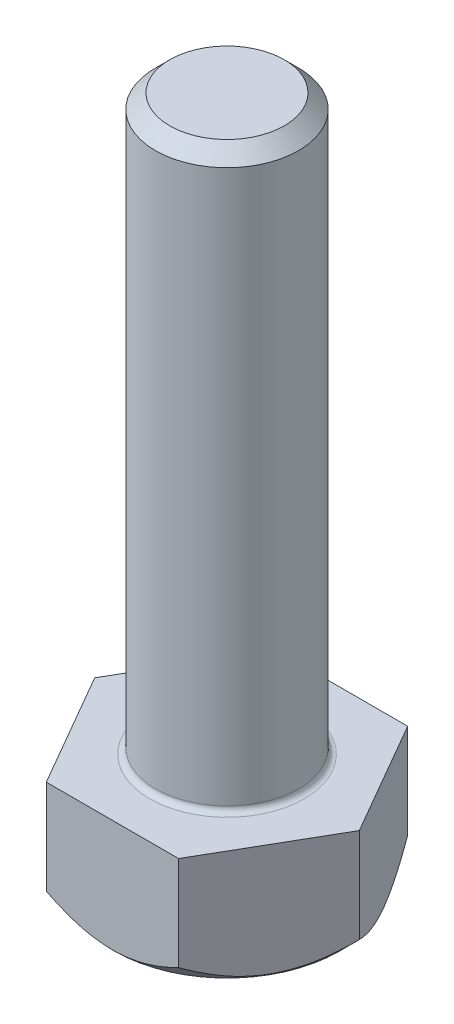
ISO-10303-21;
HEADER;
FILE_DESCRIPTION(('STEP AP214'),'2;1');
FILE_NAME('part.step','',(''),(''),'','','');
FILE_SCHEMA(('AUTOMOTIVE_DESIGN { 1 0 10303 214 1 1 1 1 }'));
ENDSEC;
DATA;
#1=APPLICATION_CONTEXT('core data for automotive mechanical design processes');
#2=APPLICATION_PROTOCOL_DEFINITION('international standard','automotive_design',2000,#1);
#3=PRODUCT_CONTEXT('',#1,'mechanical');
#4=PRODUCT('Part','Part','',(#3));
#5=PRODUCT_RELATED_PRODUCT_CATEGORY('part','',(#4));
#6=PRODUCT_DEFINITION_FORMATION('','',#4);
#7=PRODUCT_DEFINITION_CONTEXT('part definition',#1,'design');
#8=PRODUCT_DEFINITION('design','',#6,#7);
#9=PRODUCT_DEFINITION_SHAPE('','',#8);
#10=(LENGTH_UNIT() NAMED_UNIT(*) SI_UNIT(.MILLI.,.METRE.));
#11=(NAMED_UNIT(*) PLANE_ANGLE_UNIT() SI_UNIT($,.RADIAN.));
#12=(NAMED_UNIT(*) SI_UNIT($,.STERADIAN.) SOLID_ANGLE_UNIT());
#13=UNCERTAINTY_MEASURE_WITH_UNIT(LENGTH_MEASURE(1.E-05),#10,'distance_accuracy_value','');
#14=(GEOMETRIC_REPRESENTATION_CONTEXT(3) GLOBAL_UNCERTAINTY_ASSIGNED_CONTEXT((#13)) GLOBAL_UNIT_ASSIGNED_CONTEXT((#10,
#11,#12)) REPRESENTATION_CONTEXT('',''));
#15=CARTESIAN_POINT('',(0.,0.,0.));
#16=DIRECTION('',(0.,0.,1.));
#17=DIRECTION('',(1.,0.,0.));
#18=AXIS2_PLACEMENT_3D('',#15,#16,#17);
#19=CARTESIAN_POINT('',(2.30940107675855,4.,3.99999999999998));
#20=DIRECTION('',(-0.866025403784441,0.,-0.499999999999995));
#21=DIRECTION('',(-0.499999999999995,0.,0.866025403784442));
#22=AXIS2_PLACEMENT_3D('',#19,#20,#21);
#23=PLANE('',#22);
#24=CARTESIAN_POINT('',(4.61891762357085,0.700115474383801,-0.0002));
#25=CARTESIAN_POINT('',(4.57920690352856,0.660408855957502,0.0685809847183902));
#26=CARTESIAN_POINT('',(4.53919230356691,0.621920417113094,0.137888304896515));
#27=CARTESIAN_POINT('',(4.45849274714726,0.547751223735454,0.27766403676362));
#28=CARTESIAN_POINT('',(4.41780743901012,0.512072002731591,0.348133057578738));
#29=CARTESIAN_POINT('',(4.29427352009146,0.409500867650948,0.562100081603956));
#30=CARTESIAN_POINT('',(4.21037499527404,0.347513111012522,0.707416589267811));
#31=CARTESIAN_POINT('',(4.0412197030244,0.241355869009374,1.00040214981335));
#32=CARTESIAN_POINT('',(3.95600566300928,0.196919055453413,1.14799719663775));
#33=CARTESIAN_POINT('',(3.78369592639702,0.128448982129438,1.44644641508899));
#34=CARTESIAN_POINT('',(3.69660550696163,0.104364637861304,1.59729144640358));
#35=CARTESIAN_POINT('',(3.54650860589263,0.0826348808605432,1.85726690511373));
#36=CARTESIAN_POINT('',(3.48369550790696,0.079418914640874,1.96606238220571));
#37=CARTESIAN_POINT('',(3.35817126167368,0.0848400582250343,2.18347675426355));
#38=CARTESIAN_POINT('',(3.29546015687907,0.0934813231718715,2.29209557396659));
#39=CARTESIAN_POINT('',(3.17063214810068,0.122124038496493,2.50830402737842));
#40=CARTESIAN_POINT('',(3.10851598784022,0.142138194551335,2.61589237292061));
#41=CARTESIAN_POINT('',(2.98535047827849,0.192434157364746,2.82922129322166));
#42=CARTESIAN_POINT('',(2.92430104755958,0.222715176878471,2.93496200899997));
#43=CARTESIAN_POINT('',(2.81592361944269,0.285015252694335,3.12267722089207));
#44=CARTESIAN_POINT('',(2.76835567444969,0.315396279860205,3.20506731843159));
#45=CARTESIAN_POINT('',(2.67407371522753,0.381054464560417,3.36836846204151));
#46=CARTESIAN_POINT('',(2.62735972702472,0.416331771039843,3.44927946303294));
#47=CARTESIAN_POINT('',(2.53493285809123,0.490991687020957,3.60936749601025));
#48=CARTESIAN_POINT('',(2.48921734857497,0.530361387003614,3.68854908118633));
#49=CARTESIAN_POINT('',(2.39863292742737,0.612689108143273,3.84544590098819));
#50=CARTESIAN_POINT('',(2.35376351682292,0.655644927801908,3.92316199986077));
#51=CARTESIAN_POINT('',(2.30928560670471,0.700115474383791,4.00019999999998));
#52=B_SPLINE_CURVE_WITH_KNOTS('',3,(#24,#25,#26,#27,#28,#29,#30,#31,#32,#33,#34,#35,#36,#37,#38,
#39,#40,#41,#42,#43,#44,#45,#46,#47,#48,#49,#50,#51),.UNSPECIFIED.,.F.,.F.,(4,2,2,2,2,2,2,2,2,2,
2,2,2,4),(0.,0.266361961703682,0.532868334400148,1.06875865685469,1.59613884594061,
2.12219135055594,2.49866160599677,2.87526382203519,3.25228760372107,3.62928248242894,
3.92874944437186,4.22822551811358,4.52678401907575,4.82516056577912),.UNSPECIFIED.);
#53=CARTESIAN_POINT('',(4.618802153517,0.699999999999939,0.));
#54=VERTEX_POINT('',#53);
#55=CARTESIAN_POINT('',(2.30940107675855,0.699999999999935,3.99999999999998));
#56=VERTEX_POINT('',#55);
#57=EDGE_CURVE('E51',#54,#56,#52,.T.);
#58=ORIENTED_EDGE('',*,*,#57,.F.);
#59=DIRECTION('',(0.,-1.,0.));
#60=VECTOR('',#59,1.);
#61=CARTESIAN_POINT('',(4.61880215351701,4.,0.));
#62=LINE('',#61,#60);
#63=CARTESIAN_POINT('',(4.61880215351701,4.,0.));
#64=VERTEX_POINT('',#63);
#65=EDGE_CURVE('E101',#64,#54,#62,.T.);
#66=ORIENTED_EDGE('',*,*,#65,.F.);
#67=DIRECTION('',(0.499999999999995,0.,-0.866025403784441));
#68=VECTOR('',#67,1.);
#69=CARTESIAN_POINT('',(2.30940107675855,4.,3.99999999999998));
#70=LINE('',#69,#68);
#71=CARTESIAN_POINT('',(2.30940107675855,4.,3.99999999999998));
#72=VERTEX_POINT('',#71);
#73=EDGE_CURVE('E103',#72,#64,#70,.T.);
#74=ORIENTED_EDGE('',*,*,#73,.F.);
#75=DIRECTION('',(0.,-1.,0.));
#76=VECTOR('',#75,1.);
#77=CARTESIAN_POINT('',(2.30940107675855,4.,3.99999999999998));
#78=LINE('',#77,#76);
#79=EDGE_CURVE('E102',#72,#56,#78,.T.);
#80=ORIENTED_EDGE('',*,*,#79,.T.);
#81=EDGE_LOOP('',(#58,#66,#74,#80));
#82=FACE_BOUND('',#81,.T.);
#83=ADVANCED_FACE('F35',(#82),#23,.F.);
#84=CARTESIAN_POINT('',(4.61880215351701,4.,0.));
#85=DIRECTION('',(-0.866025403784438,0.,0.500000000000001));
#86=DIRECTION('',(0.500000000000001,0.,0.866025403784438));
#87=AXIS2_PLACEMENT_3D('',#84,#85,#86);
#88=PLANE('',#87);
#89=CARTESIAN_POINT('',(2.30928560670466,0.700115474383792,-4.00020000000001));
#90=CARTESIAN_POINT('',(2.34899632674695,0.660408855957493,-3.93141901528162));
#91=CARTESIAN_POINT('',(2.3890109267086,0.621920417113085,-3.86211169510349));
#92=CARTESIAN_POINT('',(2.46971048312825,0.547751223735444,-3.72233596323639));
#93=CARTESIAN_POINT('',(2.51039579126539,0.51207200273158,-3.65186694242127));
#94=CARTESIAN_POINT('',(2.63392971018405,0.409500867650934,-3.43789991839605));
#95=CARTESIAN_POINT('',(2.71782823500148,0.347513111012507,-3.29258341073219));
#96=CARTESIAN_POINT('',(2.88698352725112,0.241355869009358,-2.99959785018666));
#97=CARTESIAN_POINT('',(2.97219756726624,0.196919055453397,-2.85200280336225));
#98=CARTESIAN_POINT('',(3.1445073038785,0.128448982129421,-2.553553584911));
#99=CARTESIAN_POINT('',(3.2315977233139,0.104364637861287,-2.40270855359642));
#100=CARTESIAN_POINT('',(3.3816946243829,0.0826348808605273,-2.14273309488627));
#101=CARTESIAN_POINT('',(3.44450772236857,0.0794189146408588,-2.03393761779429));
#102=CARTESIAN_POINT('',(3.57003196860185,0.0848400582250196,-1.81652324573645));
#103=CARTESIAN_POINT('',(3.63274307339646,0.0934813231718567,-1.70790442603341));
#104=CARTESIAN_POINT('',(3.75757108217486,0.122124038496478,-1.49169597262158));
#105=CARTESIAN_POINT('',(3.81968724243531,0.14213819455132,-1.38410762707939));
#106=CARTESIAN_POINT('',(3.94285275199705,0.192434157364731,-1.17077870677835));
#107=CARTESIAN_POINT('',(4.00390218271596,0.222715176878456,-1.06503799100004));
#108=CARTESIAN_POINT('',(4.11227961083285,0.285015252694322,-0.877322779107935));
#109=CARTESIAN_POINT('',(4.15984755582585,0.315396279860193,-0.794932681568415));
#110=CARTESIAN_POINT('',(4.25412951504802,0.381054464560409,-0.631631537958489));
#111=CARTESIAN_POINT('',(4.30084350325083,0.416331771039837,-0.55072053696705));
#112=CARTESIAN_POINT('',(4.39327037218432,0.490991687020955,-0.390632503989735));
#113=CARTESIAN_POINT('',(4.43898588170059,0.530361387003614,-0.311450918813657));
#114=CARTESIAN_POINT('',(4.52957030284819,0.612689108143277,-0.154554099011793));
#115=CARTESIAN_POINT('',(4.57443971345265,0.655644927801915,-0.0768380001392093));
#116=CARTESIAN_POINT('',(4.61891762357085,0.700115474383801,0.000200000000000161));
#117=B_SPLINE_CURVE_WITH_KNOTS('',3,(#89,#90,#91,#92,#93,#94,#95,#96,#97,#98,#99,#100,#101,#102,
#103,#104,#105,#106,#107,#108,#109,#110,#111,#112,#113,#114,#115,#116),.UNSPECIFIED.,.F.,.F.,(4,
2,2,2,2,2,2,2,2,2,2,2,2,4),(0.,0.266361961703685,0.532868334400154,1.0687586568547,
1.59613884594063,2.12219135055597,2.4986616059968,2.87526382203522,3.25228760372109,
3.62928248242896,3.92874944437189,4.22822551811363,4.52678401907581,4.82516056577918),.UNSPECIFIED.);
#118=CARTESIAN_POINT('',(2.30940107675849,0.699999999999931,-4.00000000000001));
#119=VERTEX_POINT('',#118);
#120=EDGE_CURVE('E88',#119,#54,#117,.T.);
#121=ORIENTED_EDGE('',*,*,#120,.F.);
#122=DIRECTION('',(0.,-1.,0.));
#123=VECTOR('',#122,1.);
#124=CARTESIAN_POINT('',(2.3094010767585,4.,-4.00000000000001));
#125=LINE('',#124,#123);
#126=CARTESIAN_POINT('',(2.3094010767585,4.,-4.00000000000001));
#127=VERTEX_POINT('',#126);
#128=EDGE_CURVE('E108',#127,#119,#125,.T.);
#129=ORIENTED_EDGE('',*,*,#128,.F.);
#130=DIRECTION('',(-0.500000000000001,0.,-0.866025403784438));
#131=VECTOR('',#130,1.);
#132=CARTESIAN_POINT('',(4.61880215351701,4.,0.));
#133=LINE('',#132,#131);
#134=EDGE_CURVE('E106',#64,#127,#133,.T.);
#135=ORIENTED_EDGE('',*,*,#134,.F.);
#136=ORIENTED_EDGE('',*,*,#65,.T.);
#137=EDGE_LOOP('',(#121,#129,#135,#136));
#138=FACE_BOUND('',#137,.T.);
#139=ADVANCED_FACE('F105',(#138),#88,.F.);
#140=CARTESIAN_POINT('',(2.3094010767585,4.,-4.00000000000001));
#141=DIRECTION('',(0.,0.,1.));
#142=DIRECTION('',(1.,0.,0.));
#143=AXIS2_PLACEMENT_3D('',#140,#141,#142);
#144=PLANE('',#143);
#145=CARTESIAN_POINT('',(-6.98114614593353,4.12709130282916,-3.99999999999998));
#146=CARTESIAN_POINT('',(-6.87793696104197,4.0375426009286,-3.99999999999998));
#147=CARTESIAN_POINT('',(-6.77448735267709,3.94827096608037,-3.99999999999998));
#148=CARTESIAN_POINT('',(-6.56704338795069,3.77035957027395,-3.99999999999998));
#149=CARTESIAN_POINT('',(-6.46304902264425,3.6817198197481,-3.99999999999998));
#150=CARTESIAN_POINT('',(-6.15006176117822,3.41678791917285,-3.99999999999998));
#151=CARTESIAN_POINT('',(-5.94015986764224,3.24156593852898,-3.99999999999998));
#152=CARTESIAN_POINT('',(-5.51245052817203,2.89087900779337,-3.99999999999998));
#153=CARTESIAN_POINT('',(-5.29457210444063,2.71550031208714,-3.99999999999998));
#154=CARTESIAN_POINT('',(-4.85471772987806,2.37005614421194,-3.99999999999998));
#155=CARTESIAN_POINT('',(-4.63274281899686,2.19998935227496,-3.99999999999998));
#156=CARTESIAN_POINT('',(-4.18302639527992,1.86693432484984,-3.99999999999999));
#157=CARTESIAN_POINT('',(-3.95527761496562,1.70395579092458,-3.99999999999999));
#158=CARTESIAN_POINT('',(-3.60809717220038,1.46740672114988,-3.99999999999999));
#159=CARTESIAN_POINT('',(-3.49138801077282,1.38984224523112,-3.99999999999999));
#160=CARTESIAN_POINT('',(-3.25585955363092,1.23798940126102,-3.99999999999999));
#161=CARTESIAN_POINT('',(-3.13704040222774,1.16370081035927,-3.99999999999999));
#162=CARTESIAN_POINT('',(-2.89788149990968,1.01968693934192,-3.99999999999999));
#163=CARTESIAN_POINT('',(-2.77756007053809,0.949931370318152,-3.99999999999999));
#164=CARTESIAN_POINT('',(-2.53417882035755,0.815306091805872,-3.99999999999999));
#165=CARTESIAN_POINT('',(-2.41111867188936,0.750436971045192,-3.99999999999999));
#166=CARTESIAN_POINT('',(-2.16214673136424,0.626879037223734,-3.99999999999999));
#167=CARTESIAN_POINT('',(-2.03623963272419,0.568180841756657,-3.99999999999999));
#168=CARTESIAN_POINT('',(-1.78118073645083,0.458339075920007,-4.));
#169=CARTESIAN_POINT('',(-1.65202983110933,0.407193454084758,-4.));
#170=CARTESIAN_POINT('',(-1.38738138766726,0.313123320819659,-4.));
#171=CARTESIAN_POINT('',(-1.25180623112649,0.270414105323999,-4.));
#172=CARTESIAN_POINT('',(-0.977462181490911,0.196777650494333,-4.));
#173=CARTESIAN_POINT('',(-0.838693801721602,0.165848531293118,-4.));
#174=CARTESIAN_POINT('',(-0.559624752362383,0.117833620010087,-4.));
#175=CARTESIAN_POINT('',(-0.419338998099909,0.100662853961317,-4.));
#176=CARTESIAN_POINT('',(-0.137732511117991,0.0811049255479451,-4.));
#177=CARTESIAN_POINT('',(0.00358810879581085,0.078716175195079,-4.));
#178=CARTESIAN_POINT('',(0.285874972510526,0.0889146058383092,-4.));
#179=CARTESIAN_POINT('',(0.426840437320116,0.101522875026919,-4.));
#180=CARTESIAN_POINT('',(0.706785540830818,0.140792857614438,-4.));
#181=CARTESIAN_POINT('',(0.845764780734548,0.1674573536336,-4.00000000000001));
#182=CARTESIAN_POINT('',(1.12171525898713,0.233322674772973,-4.00000000000001));
#183=CARTESIAN_POINT('',(1.25866510523636,0.272611558158177,-4.00000000000001));
#184=CARTESIAN_POINT('',(1.52908834069935,0.361594405827923,-4.00000000000001));
#185=CARTESIAN_POINT('',(1.6625616855479,0.411288502825075,-4.00000000000001));
#186=CARTESIAN_POINT('',(1.95536122449262,0.531120895026026,-4.00000000000001));
#187=CARTESIAN_POINT('',(2.11382544400314,0.603347532343984,-4.00000000000001));
#188=CARTESIAN_POINT('',(2.42603794900499,0.757437129001317,-4.00000000000001));
#189=CARTESIAN_POINT('',(2.57978344985653,0.839305645488604,-4.00000000000001));
#190=CARTESIAN_POINT('',(2.88342663972389,1.01053885711325,-4.00000000000001));
#191=CARTESIAN_POINT('',(3.03331571463857,1.099918703133,-4.00000000000001));
#192=CARTESIAN_POINT('',(3.32952662511669,1.28430474396474,-4.00000000000001));
#193=CARTESIAN_POINT('',(3.47584916027498,1.37930982261507,-4.00000000000001));
#194=CARTESIAN_POINT('',(3.76630620503074,1.57423103979624,-4.00000000000001));
#195=CARTESIAN_POINT('',(3.91042486029584,1.67417069197554,-4.00000000000002));
#196=CARTESIAN_POINT('',(4.19616634067178,1.87755425690437,-4.00000000000002));
#197=CARTESIAN_POINT('',(4.33778907534001,1.98099829624419,-4.00000000000002));
#198=CARTESIAN_POINT('',(4.61877643054636,2.19056329764121,-4.00000000000002));
#199=CARTESIAN_POINT('',(4.75814350045658,2.29668098420657,-4.00000000000002));
#200=CARTESIAN_POINT('',(5.03512024738794,2.51118879382164,-4.00000000000002));
#201=CARTESIAN_POINT('',(5.17272986712145,2.6195789906457,-4.00000000000002));
#202=CARTESIAN_POINT('',(5.59497795008181,2.95681598614826,-4.00000000000002));
#203=CARTESIAN_POINT('',(5.8771451391583,3.18875848422638,-4.00000000000002));
#204=CARTESIAN_POINT('',(6.29540023140548,3.53951322082581,-4.00000000000002));
#205=CARTESIAN_POINT('',(6.43324157418379,3.65625547859004,-4.00000000000002));
#206=CARTESIAN_POINT('',(6.7079094900278,3.8908680732726,-4.00000000000003));
#207=CARTESIAN_POINT('',(6.84473627717866,4.00873815944256,-4.00000000000003));
#208=CARTESIAN_POINT('',(6.98114614593351,4.12709130282924,-4.00000000000003));
#209=B_SPLINE_CURVE_WITH_KNOTS('',3,(#145,#146,#147,#148,#149,#150,#151,#152,#153,#154,#155,
#156,#157,#158,#159,#160,#161,#162,#163,#164,#165,#166,#167,#168,#169,#170,#171,#172,#173,#174,
#175,#176,#177,#178,#179,#180,#181,#182,#183,#184,#185,#186,#187,#188,#189,#190,#191,#192,#193,
#194,#195,#196,#197,#198,#199,#200,#201,#202,#203,#204,#205,#206,#207,#208),.UNSPECIFIED.,.F.,
.F.,(4,2,2,2,2,2,2,2,2,2,2,2,2,2,2,2,2,2,2,2,2,2,2,2,2,2,2,2,2,2,2,4),(0.,0.409925978651295,
0.819858709524671,1.64010261713085,2.47912275465721,3.31793274805462,4.15785682736262,
4.57821400157808,4.99854253567476,5.41568896936065,5.83288558145875,6.24943841487735,
6.66587789330006,7.09186216213645,7.51777842391307,7.94104342726952,8.36426295972796,
8.78807831030743,9.21197759239367,9.63890031479421,10.0658284826842,10.5878304384244,
11.1101347388045,11.6335190846318,12.1567999260297,12.6828747803224,13.2089686585187,
13.7344466666551,14.2599417603085,15.3555993243773,15.8975012917649,16.439285455911),.UNSPECIFIED.);
#210=CARTESIAN_POINT('',(-2.30940107675852,0.699999999999915,-3.99999999999999));
#211=VERTEX_POINT('',#210);
#212=EDGE_CURVE('E91',#211,#119,#209,.T.);
#213=ORIENTED_EDGE('',*,*,#212,.F.);
#214=DIRECTION('',(0.,-1.,0.));
#215=VECTOR('',#214,1.);
#216=CARTESIAN_POINT('',(-2.30940107675852,4.,-3.99999999999999));
#217=LINE('',#216,#215);
#218=CARTESIAN_POINT('',(-2.30940107675852,4.,-3.99999999999999));
#219=VERTEX_POINT('',#218);
#220=EDGE_CURVE('E113',#219,#211,#217,.T.);
#221=ORIENTED_EDGE('',*,*,#220,.F.);
#222=DIRECTION('',(-1.,0.,0.));
#223=VECTOR('',#222,1.);
#224=CARTESIAN_POINT('',(2.3094010767585,4.,-4.00000000000001));
#225=LINE('',#224,#223);
#226=EDGE_CURVE('E294',#127,#219,#225,.T.);
#227=ORIENTED_EDGE('',*,*,#226,.F.);
#228=ORIENTED_EDGE('',*,*,#128,.T.);
#229=EDGE_LOOP('',(#213,#221,#227,#228));
#230=FACE_BOUND('',#229,.T.);
#231=ADVANCED_FACE('F137',(#230),#144,.F.);
#232=CARTESIAN_POINT('',(-2.30940107675852,4.,-3.99999999999999));
#233=DIRECTION('',(0.866025403784442,0.,0.499999999999995));
#234=DIRECTION('',(0.499999999999995,0.,-0.866025403784442));
#235=AXIS2_PLACEMENT_3D('',#232,#233,#234);
#236=PLANE('',#235);
#237=CARTESIAN_POINT('',(-4.61891762357085,0.700115474383764,0.000200000000032253));
#238=CARTESIAN_POINT('',(-4.57920690352856,0.660408855957465,-0.0685809847183586));
#239=CARTESIAN_POINT('',(-4.53919230356691,0.621920417113057,-0.137888304896484));
#240=CARTESIAN_POINT('',(-4.45849274714725,0.547751223735416,-0.277664036763591));
#241=CARTESIAN_POINT('',(-4.41780743901012,0.512072002731552,-0.34813305757871));
#242=CARTESIAN_POINT('',(-4.29427352009146,0.409500867650907,-0.56210008160393));
#243=CARTESIAN_POINT('',(-4.21037499527403,0.347513111012481,-0.707416589267787));
#244=CARTESIAN_POINT('',(-4.04121970302439,0.241355869009332,-1.00040214981333));
#245=CARTESIAN_POINT('',(-3.95600566300927,0.196919055453371,-1.14799719663773));
#246=CARTESIAN_POINT('',(-3.78369592639701,0.128448982129395,-1.44644641508898));
#247=CARTESIAN_POINT('',(-3.69660550696162,0.104364637861261,-1.59729144640356));
#248=CARTESIAN_POINT('',(-3.54650860589262,0.0826348808605014,-1.85726690511372));
#249=CARTESIAN_POINT('',(-3.48369550790695,0.0794189146408329,-1.9660623822057));
#250=CARTESIAN_POINT('',(-3.35817126167366,0.0848400582249946,-2.18347675426354));
#251=CARTESIAN_POINT('',(-3.29546015687905,0.0934813231718324,-2.29209557396658));
#252=CARTESIAN_POINT('',(-3.17063214810066,0.122124038496455,-2.50830402737842));
#253=CARTESIAN_POINT('',(-3.10851598784021,0.142138194551297,-2.61589237292061));
#254=CARTESIAN_POINT('',(-2.98535047827847,0.192434157364709,-2.82922129322165));
#255=CARTESIAN_POINT('',(-2.92430104755956,0.222715176878433,-2.93496200899996));
#256=CARTESIAN_POINT('',(-2.81592361944267,0.285015252694299,-3.12267722089207));
#257=CARTESIAN_POINT('',(-2.76835567444967,0.315396279860171,-3.20506731843159));
#258=CARTESIAN_POINT('',(-2.67407371522751,0.381054464560386,-3.36836846204151));
#259=CARTESIAN_POINT('',(-2.6273597270247,0.416331771039814,-3.44927946303295));
#260=CARTESIAN_POINT('',(-2.53493285809121,0.49099168702093,-3.60936749601026));
#261=CARTESIAN_POINT('',(-2.48921734857494,0.530361387003589,-3.68854908118634));
#262=CARTESIAN_POINT('',(-2.39863292742734,0.612689108143251,-3.8454459009882));
#263=CARTESIAN_POINT('',(-2.35376351682289,0.655644927801888,-3.92316199986078));
#264=CARTESIAN_POINT('',(-2.30928560670469,0.700115474383773,-4.00019999999999));
#265=B_SPLINE_CURVE_WITH_KNOTS('',3,(#237,#238,#239,#240,#241,#242,#243,#244,#245,#246,#247,
#248,#249,#250,#251,#252,#253,#254,#255,#256,#257,#258,#259,#260,#261,#262,#263,#264),
.UNSPECIFIED.,.F.,.F.,(4,2,2,2,2,2,2,2,2,2,2,2,2,4),(0.,0.266361961703685,0.532868334400154,
1.06875865685471,1.59613884594063,2.12219135055597,2.4986616059968,2.87526382203523,
3.25228760372111,3.62928248242897,3.9287494443719,4.22822551811363,4.52678401907581,
4.82516056577918),.UNSPECIFIED.);
#266=CARTESIAN_POINT('',(-4.61880215351701,0.699999999999907,0.));
#267=VERTEX_POINT('',#266);
#268=EDGE_CURVE('E180',#267,#211,#265,.T.);
#269=ORIENTED_EDGE('',*,*,#268,.F.);
#270=DIRECTION('',(0.,-1.,0.));
#271=VECTOR('',#270,1.);
#272=CARTESIAN_POINT('',(-4.61880215351701,4.,0.));
#273=LINE('',#272,#271);
#274=CARTESIAN_POINT('',(-4.61880215351701,4.,0.));
#275=VERTEX_POINT('',#274);
#276=EDGE_CURVE('E306',#275,#267,#273,.T.);
#277=ORIENTED_EDGE('',*,*,#276,.F.);
#278=DIRECTION('',(-0.499999999999995,0.,0.866025403784442));
#279=VECTOR('',#278,1.);
#280=CARTESIAN_POINT('',(-2.30940107675852,4.,-3.99999999999999));
#281=LINE('',#280,#279);
#282=EDGE_CURVE('E295',#219,#275,#281,.T.);
#283=ORIENTED_EDGE('',*,*,#282,.F.);
#284=ORIENTED_EDGE('',*,*,#220,.T.);
#285=EDGE_LOOP('',(#269,#277,#283,#284));
#286=FACE_BOUND('',#285,.T.);
#287=ADVANCED_FACE('F192',(#286),#236,.F.);
#288=CARTESIAN_POINT('',(-4.61880215351701,4.,0.));
#289=DIRECTION('',(0.866025403784435,0.,-0.500000000000007));
#290=DIRECTION('',(-0.500000000000007,0.,-0.866025403784434));
#291=AXIS2_PLACEMENT_3D('',#288,#289,#290);
#292=PLANE('',#291);
#293=CARTESIAN_POINT('',(-2.30928560670463,0.700115474383773,4.00020000000003));
#294=CARTESIAN_POINT('',(-2.34899632674692,0.660408855957473,3.93141901528163));
#295=CARTESIAN_POINT('',(-2.38901092670857,0.621920417113066,3.86211169510351));
#296=CARTESIAN_POINT('',(-2.46971048312823,0.547751223735424,3.7223359632364));
#297=CARTESIAN_POINT('',(-2.51039579126536,0.51207200273156,3.65186694242129));
#298=CARTESIAN_POINT('',(-2.63392971018403,0.409500867650914,3.43789991839607));
#299=CARTESIAN_POINT('',(-2.71782823500145,0.347513111012486,3.29258341073221));
#300=CARTESIAN_POINT('',(-2.8869835272511,0.241355869009336,2.99959785018667));
#301=CARTESIAN_POINT('',(-2.97219756726622,0.196919055453374,2.85200280336227));
#302=CARTESIAN_POINT('',(-3.14450730387849,0.128448982129398,2.55355358491102));
#303=CARTESIAN_POINT('',(-3.23159772331388,0.104364637861263,2.40270855359644));
#304=CARTESIAN_POINT('',(-3.38169462438288,0.082634880860502,2.14273309488629));
#305=CARTESIAN_POINT('',(-3.44450772236856,0.0794189146408329,2.03393761779431));
#306=CARTESIAN_POINT('',(-3.57003196860184,0.0848400582249938,1.81652324573647));
#307=CARTESIAN_POINT('',(-3.63274307339646,0.0934813231718314,1.70790442603343));
#308=CARTESIAN_POINT('',(-3.75757108217485,0.122124038496453,1.4916959726216));
#309=CARTESIAN_POINT('',(-3.8196872424353,0.142138194551294,1.38410762707941));
#310=CARTESIAN_POINT('',(-3.94285275199704,0.192434157364705,1.17077870677836));
#311=CARTESIAN_POINT('',(-4.00390218271596,0.222715176878429,1.06503799100005));
#312=CARTESIAN_POINT('',(-4.11227961083285,0.285015252694295,0.877322779107952));
#313=CARTESIAN_POINT('',(-4.15984755582585,0.315396279860166,0.794932681568435));
#314=CARTESIAN_POINT('',(-4.25412951504802,0.38105446456038,0.631631537958511));
#315=CARTESIAN_POINT('',(-4.30084350325083,0.416331771039807,0.550720536967073));
#316=CARTESIAN_POINT('',(-4.39327037218432,0.490991687020922,0.390632503989761));
#317=CARTESIAN_POINT('',(-4.43898588170059,0.530361387003581,0.311450918813685));
#318=CARTESIAN_POINT('',(-4.52957030284819,0.612689108143242,0.154554099011824));
#319=CARTESIAN_POINT('',(-4.57443971345264,0.655644927801879,0.076838000139241));
#320=CARTESIAN_POINT('',(-4.61891762357085,0.700115474383764,-0.000199999999967812));
#321=B_SPLINE_CURVE_WITH_KNOTS('',3,(#293,#294,#295,#296,#297,#298,#299,#300,#301,#302,#303,
#304,#305,#306,#307,#308,#309,#310,#311,#312,#313,#314,#315,#316,#317,#318,#319,#320),
.UNSPECIFIED.,.F.,.F.,(4,2,2,2,2,2,2,2,2,2,2,2,2,4),(0.,0.266361961703684,0.532868334400154,
1.06875865685471,1.59613884594063,2.12219135055597,2.49866160599681,2.87526382203523,
3.25228760372111,3.62928248242898,3.9287494443719,4.22822551811363,4.52678401907581,
4.82516056577918),.UNSPECIFIED.);
#322=CARTESIAN_POINT('',(-2.30940107675846,0.699999999999915,4.00000000000002));
#323=VERTEX_POINT('',#322);
#324=EDGE_CURVE('E172',#323,#267,#321,.T.);
#325=ORIENTED_EDGE('',*,*,#324,.F.);
#326=DIRECTION('',(0.,-1.,0.));
#327=VECTOR('',#326,1.);
#328=CARTESIAN_POINT('',(-2.30940107675847,4.,4.00000000000002));
#329=LINE('',#328,#327);
#330=CARTESIAN_POINT('',(-2.30940107675847,4.,4.00000000000002));
#331=VERTEX_POINT('',#330);
#332=EDGE_CURVE('E303',#331,#323,#329,.T.);
#333=ORIENTED_EDGE('',*,*,#332,.F.);
#334=DIRECTION('',(0.500000000000007,0.,0.866025403784435));
#335=VECTOR('',#334,1.);
#336=CARTESIAN_POINT('',(-4.61880215351701,4.,0.));
#337=LINE('',#336,#335);
#338=EDGE_CURVE('E299',#275,#331,#337,.T.);
#339=ORIENTED_EDGE('',*,*,#338,.F.);
#340=ORIENTED_EDGE('',*,*,#276,.T.);
#341=EDGE_LOOP('',(#325,#333,#339,#340));
#342=FACE_BOUND('',#341,.T.);
#343=ADVANCED_FACE('F196',(#342),#292,.F.);
#344=CARTESIAN_POINT('',(-2.30940107675847,4.,4.00000000000002));
#345=DIRECTION('',(0.,0.,-1.));
#346=DIRECTION('',(-1.,0.,0.));
#347=AXIS2_PLACEMENT_3D('',#344,#345,#346);
#348=PLANE('',#347);
#349=CARTESIAN_POINT('',(6.98114614593356,4.12709130282924,3.99999999999993));
#350=CARTESIAN_POINT('',(6.877936961042,4.03754260092868,3.99999999999993));
#351=CARTESIAN_POINT('',(6.77448735267712,3.94827096608044,3.99999999999993));
#352=CARTESIAN_POINT('',(6.56704338795072,3.77035957027402,3.99999999999993));
#353=CARTESIAN_POINT('',(6.46304902264428,3.68171981974817,3.99999999999993));
#354=CARTESIAN_POINT('',(6.15006176117825,3.41678791917292,3.99999999999994));
#355=CARTESIAN_POINT('',(5.94015986764227,3.24156593852904,3.99999999999994));
#356=CARTESIAN_POINT('',(5.51245052817207,2.89087900779343,3.99999999999994));
#357=CARTESIAN_POINT('',(5.29457210444066,2.71550031208719,3.99999999999994));
#358=CARTESIAN_POINT('',(4.85471772987809,2.37005614421199,3.99999999999995));
#359=CARTESIAN_POINT('',(4.63274281899689,2.199989352275,3.99999999999995));
#360=CARTESIAN_POINT('',(4.18302639527996,1.86693432484988,3.99999999999996));
#361=CARTESIAN_POINT('',(3.95527761496566,1.70395579092462,3.99999999999996));
#362=CARTESIAN_POINT('',(3.60809717220041,1.46740672114991,3.99999999999996));
#363=CARTESIAN_POINT('',(3.49138801077285,1.38984224523116,3.99999999999996));
#364=CARTESIAN_POINT('',(3.25585955363095,1.23798940126105,3.99999999999997));
#365=CARTESIAN_POINT('',(3.13704040222778,1.1637008103593,3.99999999999997));
#366=CARTESIAN_POINT('',(2.89788149990972,1.01968693934195,3.99999999999997));
#367=CARTESIAN_POINT('',(2.77756007053813,0.949931370318182,3.99999999999997));
#368=CARTESIAN_POINT('',(2.53417882035759,0.815306091805898,3.99999999999998));
#369=CARTESIAN_POINT('',(2.4111186718894,0.750436971045217,3.99999999999998));
#370=CARTESIAN_POINT('',(2.16214673136428,0.626879037223756,3.99999999999998));
#371=CARTESIAN_POINT('',(2.03623963272423,0.568180841756677,3.99999999999998));
#372=CARTESIAN_POINT('',(1.78118073645087,0.458339075920024,3.99999999999998));
#373=CARTESIAN_POINT('',(1.65202983110937,0.407193454084774,3.99999999999998));
#374=CARTESIAN_POINT('',(1.3873813876673,0.313123320819673,3.99999999999999));
#375=CARTESIAN_POINT('',(1.25180623112653,0.270414105324012,3.99999999999999));
#376=CARTESIAN_POINT('',(0.977462181490949,0.196777650494342,3.99999999999999));
#377=CARTESIAN_POINT('',(0.83869380172164,0.165848531293125,3.99999999999999));
#378=CARTESIAN_POINT('',(0.55962475236242,0.117833620010093,4.));
#379=CARTESIAN_POINT('',(0.419338998099946,0.100662853961322,4.));
#380=CARTESIAN_POINT('',(0.137732511118028,0.0811049255479466,4.));
#381=CARTESIAN_POINT('',(-0.00358810879577464,0.0787161751950783,4.));
#382=CARTESIAN_POINT('',(-0.285874972510491,0.0889146058383056,4.));
#383=CARTESIAN_POINT('',(-0.426840437320082,0.101522875026914,4.00000000000001));
#384=CARTESIAN_POINT('',(-0.706785540830785,0.140792857614431,4.00000000000001));
#385=CARTESIAN_POINT('',(-0.845764780734517,0.167457353633592,4.00000000000001));
#386=CARTESIAN_POINT('',(-1.1217152589871,0.233322674772963,4.00000000000001));
#387=CARTESIAN_POINT('',(-1.25866510523633,0.272611558158167,4.00000000000001));
#388=CARTESIAN_POINT('',(-1.52908834069933,0.361594405827911,4.00000000000002));
#389=CARTESIAN_POINT('',(-1.66256168554787,0.411288502825063,4.00000000000002));
#390=CARTESIAN_POINT('',(-1.95536122449259,0.531120895026011,4.00000000000002));
#391=CARTESIAN_POINT('',(-2.11382544400312,0.603347532343968,4.00000000000002));
#392=CARTESIAN_POINT('',(-2.42603794900496,0.757437129001298,4.00000000000003));
#393=CARTESIAN_POINT('',(-2.5797834498565,0.839305645488583,4.00000000000003));
#394=CARTESIAN_POINT('',(-2.88342663972386,1.01053885711323,4.00000000000003));
#395=CARTESIAN_POINT('',(-3.03331571463854,1.09991870313298,4.00000000000003));
#396=CARTESIAN_POINT('',(-3.32952662511666,1.28430474396471,4.00000000000004));
#397=CARTESIAN_POINT('',(-3.47584916027495,1.37930982261504,4.00000000000004));
#398=CARTESIAN_POINT('',(-3.76630620503072,1.57423103979621,4.00000000000004));
#399=CARTESIAN_POINT('',(-3.91042486029582,1.67417069197551,4.00000000000004));
#400=CARTESIAN_POINT('',(-4.19616634067175,1.87755425690434,4.00000000000005));
#401=CARTESIAN_POINT('',(-4.33778907533999,1.98099829624415,4.00000000000005));
#402=CARTESIAN_POINT('',(-4.61877643054634,2.19056329764117,4.00000000000005));
#403=CARTESIAN_POINT('',(-4.75814350045656,2.29668098420653,4.00000000000005));
#404=CARTESIAN_POINT('',(-5.03512024738792,2.51118879382159,4.00000000000005));
#405=CARTESIAN_POINT('',(-5.17272986712143,2.61957899064566,4.00000000000006));
#406=CARTESIAN_POINT('',(-5.59497795008178,2.95681598614821,4.00000000000006));
#407=CARTESIAN_POINT('',(-5.87714513915827,3.18875848422633,4.00000000000006));
#408=CARTESIAN_POINT('',(-6.29540023140546,3.53951322082575,4.00000000000007));
#409=CARTESIAN_POINT('',(-6.43324157418377,3.65625547858998,4.00000000000007));
#410=CARTESIAN_POINT('',(-6.70790949002777,3.89086807327253,4.00000000000007));
#411=CARTESIAN_POINT('',(-6.84473627717863,4.00873815944249,4.00000000000007));
#412=CARTESIAN_POINT('',(-6.98114614593348,4.12709130282917,4.00000000000007));
#413=B_SPLINE_CURVE_WITH_KNOTS('',3,(#349,#350,#351,#352,#353,#354,#355,#356,#357,#358,#359,
#360,#361,#362,#363,#364,#365,#366,#367,#368,#369,#370,#371,#372,#373,#374,#375,#376,#377,#378,
#379,#380,#381,#382,#383,#384,#385,#386,#387,#388,#389,#390,#391,#392,#393,#394,#395,#396,#397,
#398,#399,#400,#401,#402,#403,#404,#405,#406,#407,#408,#409,#410,#411,#412),.UNSPECIFIED.,.F.,
.F.,(4,2,2,2,2,2,2,2,2,2,2,2,2,2,2,2,2,2,2,2,2,2,2,2,2,2,2,2,2,2,2,4),(0.,0.409925978651296,
0.819858709524674,1.64010261713086,2.47912275465722,3.31793274805463,4.15785682736264,
4.57821400157809,4.99854253567477,5.41568896936066,5.83288558145877,6.24943841487737,
6.66587789330008,7.09186216213648,7.5177784239131,7.94104342726955,8.36426295972799,
8.78807831030746,9.21197759239371,9.63890031479424,10.0658284826842,10.5878304384245,
11.1101347388045,11.6335190846318,12.1567999260297,12.6828747803224,13.2089686585187,
13.7344466666551,14.2599417603085,15.3555993243773,15.8975012917649,16.439285455911),.UNSPECIFIED.);
#414=EDGE_CURVE('E162',#56,#323,#413,.T.);
#415=ORIENTED_EDGE('',*,*,#414,.F.);
#416=ORIENTED_EDGE('',*,*,#79,.F.);
#417=DIRECTION('',(1.,0.,0.));
#418=VECTOR('',#417,1.);
#419=CARTESIAN_POINT('',(-2.30940107675847,4.,4.00000000000002));
#420=LINE('',#419,#418);
#421=EDGE_CURVE('E59',#331,#72,#420,.T.);
#422=ORIENTED_EDGE('',*,*,#421,.F.);
#423=ORIENTED_EDGE('',*,*,#332,.T.);
#424=EDGE_LOOP('',(#415,#416,#422,#423));
#425=FACE_BOUND('',#424,.T.);
#426=ADVANCED_FACE('F200',(#425),#348,.F.);
#427=CARTESIAN_POINT('',(0.,4.,0.));
#428=DIRECTION('',(0.,1.,0.));
#429=DIRECTION('',(0.,0.,1.));
#430=AXIS2_PLACEMENT_3D('',#427,#428,#429);
#431=PLANE('',#430);
#432=CARTESIAN_POINT('',(0.,4.,0.));
#433=DIRECTION('',(0.,1.,0.));
#434=DIRECTION('',(0.,0.,1.));
#435=AXIS2_PLACEMENT_3D('',#432,#433,#434);
#436=CIRCLE('',#435,2.7);
#437=CARTESIAN_POINT('',(0.,4.,2.7));
#438=VERTEX_POINT('',#437);
#439=EDGE_CURVE('E111',#438,#438,#436,.F.);
#440=ORIENTED_EDGE('',*,*,#439,.T.);
#441=EDGE_LOOP('',(#440));
#442=FACE_BOUND('',#441,.T.);
#443=ORIENTED_EDGE('',*,*,#73,.T.);
#444=ORIENTED_EDGE('',*,*,#134,.T.);
#445=ORIENTED_EDGE('',*,*,#226,.T.);
#446=ORIENTED_EDGE('',*,*,#282,.T.);
#447=ORIENTED_EDGE('',*,*,#338,.T.);
#448=ORIENTED_EDGE('',*,*,#421,.T.);
#449=EDGE_LOOP('',(#443,#444,#445,#446,#447,#448));
#450=FACE_BOUND('',#449,.T.);
#451=ADVANCED_FACE('F205',(#442,#450),#431,.T.);
#452=CARTESIAN_POINT('',(0.,24.,0.));
#453=DIRECTION('',(0.,-1.,0.));
#454=DIRECTION('',(0.,0.,-1.));
#455=AXIS2_PLACEMENT_3D('',#452,#453,#454);
#456=CYLINDRICAL_SURFACE('',#455,2.5);
#457=CARTESIAN_POINT('',(0.,23.5,0.));
#458=DIRECTION('',(0.,1.,0.));
#459=DIRECTION('',(0.,0.,1.));
#460=AXIS2_PLACEMENT_3D('',#457,#458,#459);
#461=CIRCLE('',#460,2.5);
#462=CARTESIAN_POINT('',(0.,23.5,2.5));
#463=VERTEX_POINT('',#462);
#464=EDGE_CURVE('E11',#463,#463,#461,.F.);
#465=ORIENTED_EDGE('',*,*,#464,.T.);
#466=EDGE_LOOP('',(#465));
#467=FACE_BOUND('',#466,.T.);
#468=CARTESIAN_POINT('',(0.,4.2,0.));
#469=DIRECTION('',(0.,1.,0.));
#470=DIRECTION('',(0.,0.,1.));
#471=AXIS2_PLACEMENT_3D('',#468,#469,#470);
#472=CIRCLE('',#471,2.5);
#473=CARTESIAN_POINT('',(0.,4.2,2.5));
#474=VERTEX_POINT('',#473);
#475=EDGE_CURVE('E107',#474,#474,#472,.T.);
#476=ORIENTED_EDGE('',*,*,#475,.T.);
#477=EDGE_LOOP('',(#476));
#478=FACE_BOUND('',#477,.T.);
#479=ADVANCED_FACE('F211',(#467,#478),#456,.T.);
#480=CARTESIAN_POINT('',(0.,24.,0.));
#481=DIRECTION('',(0.,1.,0.));
#482=DIRECTION('',(0.,0.,1.));
#483=AXIS2_PLACEMENT_3D('',#480,#481,#482);
#484=PLANE('',#483);
#485=CARTESIAN_POINT('',(0.,24.,0.));
#486=DIRECTION('',(0.,1.,0.));
#487=DIRECTION('',(0.,0.,1.));
#488=AXIS2_PLACEMENT_3D('',#485,#486,#487);
#489=CIRCLE('',#488,2.);
#490=CARTESIAN_POINT('',(0.,24.,2.));
#491=VERTEX_POINT('',#490);
#492=EDGE_CURVE('E44',#491,#491,#489,.T.);
#493=ORIENTED_EDGE('',*,*,#492,.T.);
#494=EDGE_LOOP('',(#493));
#495=FACE_BOUND('',#494,.T.);
#496=ADVANCED_FACE('F121',(#495),#484,.T.);
#497=CARTESIAN_POINT('',(0.,0.,0.));
#498=DIRECTION('',(0.,1.,0.));
#499=DIRECTION('',(-1.,0.,0.));
#500=AXIS2_PLACEMENT_3D('',#497,#498,#499);
#501=CONICAL_SURFACE('',#500,3.918802153517,0.785398163397507);
#502=CARTESIAN_POINT('',(0.,0.,0.));
#503=DIRECTION('',(0.,-1.,0.));
#504=DIRECTION('',(1.,0.,0.));
#505=AXIS2_PLACEMENT_3D('',#502,#503,#504);
#506=CIRCLE('',#505,3.918802153517);
#507=CARTESIAN_POINT('',(3.918802153517,0.,0.));
#508=VERTEX_POINT('',#507);
#509=EDGE_CURVE('E317',#508,#508,#506,.T.);
#510=ORIENTED_EDGE('',*,*,#509,.F.);
#511=EDGE_LOOP('',(#510));
#512=FACE_BOUND('',#511,.T.);
#513=ORIENTED_EDGE('',*,*,#57,.T.);
#514=ORIENTED_EDGE('',*,*,#414,.T.);
#515=ORIENTED_EDGE('',*,*,#324,.T.);
#516=ORIENTED_EDGE('',*,*,#268,.T.);
#517=ORIENTED_EDGE('',*,*,#212,.T.);
#518=ORIENTED_EDGE('',*,*,#120,.T.);
#519=EDGE_LOOP('',(#513,#514,#515,#516,#517,#518));
#520=FACE_BOUND('',#519,.T.);
#521=ADVANCED_FACE('F89',(#512,#520),#501,.T.);
#522=CARTESIAN_POINT('',(0.,0.,0.));
#523=DIRECTION('',(0.,1.,0.));
#524=DIRECTION('',(0.,0.,1.));
#525=AXIS2_PLACEMENT_3D('',#522,#523,#524);
#526=PLANE('',#525);
#527=ORIENTED_EDGE('',*,*,#509,.T.);
#528=EDGE_LOOP('',(#527));
#529=FACE_BOUND('',#528,.T.);
#530=ADVANCED_FACE('F129',(#529),#526,.F.);
#531=CARTESIAN_POINT('',(0.,4.2,0.));
#532=DIRECTION('',(0.,1.,0.));
#533=DIRECTION('',(0.,0.,1.));
#534=AXIS2_PLACEMENT_3D('',#531,#532,#533);
#535=TOROIDAL_SURFACE('',#534,2.7,0.2);
#536=ORIENTED_EDGE('',*,*,#439,.F.);
#537=EDGE_LOOP('',(#536));
#538=FACE_BOUND('',#537,.T.);
#539=ORIENTED_EDGE('',*,*,#475,.F.);
#540=EDGE_LOOP('',(#539));
#541=FACE_BOUND('',#540,.T.);
#542=ADVANCED_FACE('F124',(#538,#541),#535,.F.);
#543=CARTESIAN_POINT('',(0.,24.,0.));
#544=DIRECTION('',(0.,-1.,0.));
#545=DIRECTION('',(0.,0.,-1.));
#546=AXIS2_PLACEMENT_3D('',#543,#544,#545);
#547=CONICAL_SURFACE('',#546,2.,0.785398163397443);
#548=ORIENTED_EDGE('',*,*,#464,.F.);
#549=EDGE_LOOP('',(#548));
#550=FACE_BOUND('',#549,.T.);
#551=ORIENTED_EDGE('',*,*,#492,.F.);
#552=EDGE_LOOP('',(#551));
#553=FACE_BOUND('',#552,.T.);
#554=ADVANCED_FACE('F38',(#550,#553),#547,.T.);
#555=CLOSED_SHELL('',(#83,#139,#231,#287,#343,#426,#451,#479,#496,#521,#530,#542,#554));
#556=MANIFOLD_SOLID_BREP('B2',#555);
#557=ADVANCED_BREP_SHAPE_REPRESENTATION('',(#18,#556),#14);
#558=SHAPE_DEFINITION_REPRESENTATION(#9,#557);
ENDSEC;
END-ISO-10303-21;
